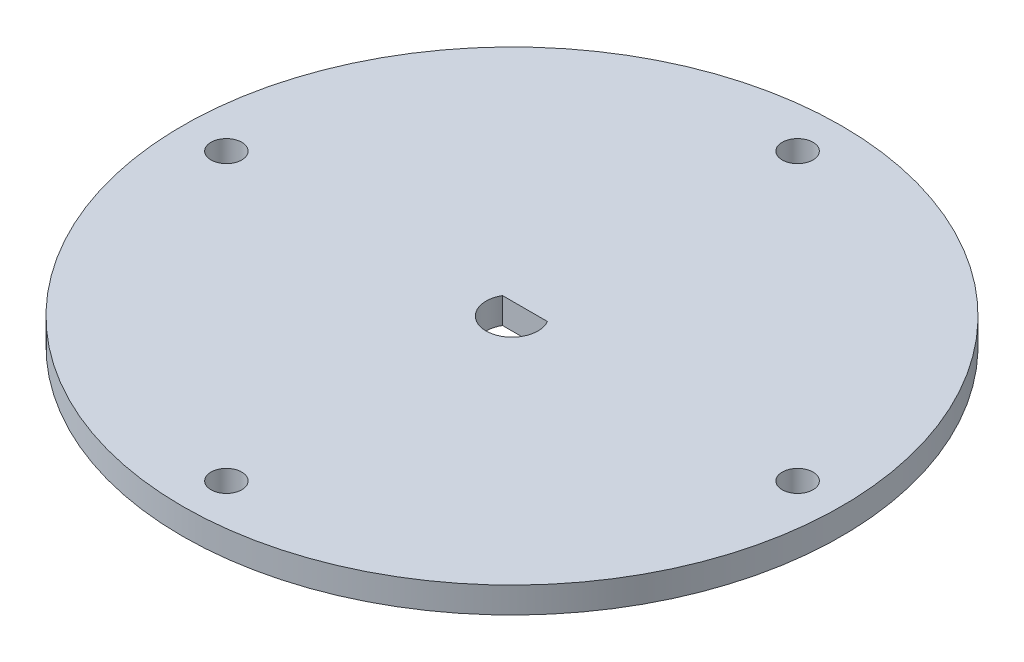
ISO-10303-21;
HEADER;
FILE_DESCRIPTION(('STEP AP214'),'2;1');
FILE_NAME('part.step','',(''),(''),'','','');
FILE_SCHEMA(('AUTOMOTIVE_DESIGN { 1 0 10303 214 1 1 1 1 }'));
ENDSEC;
DATA;
#1=APPLICATION_CONTEXT('core data for automotive mechanical design processes');
#2=APPLICATION_PROTOCOL_DEFINITION('international standard','automotive_design',2000,#1);
#3=PRODUCT_CONTEXT('',#1,'mechanical');
#4=PRODUCT('Part','Part','',(#3));
#5=PRODUCT_RELATED_PRODUCT_CATEGORY('part','',(#4));
#6=PRODUCT_DEFINITION_FORMATION('','',#4);
#7=PRODUCT_DEFINITION_CONTEXT('part definition',#1,'design');
#8=PRODUCT_DEFINITION('design','',#6,#7);
#9=PRODUCT_DEFINITION_SHAPE('','',#8);
#10=(LENGTH_UNIT() NAMED_UNIT(*) SI_UNIT(.MILLI.,.METRE.));
#11=(NAMED_UNIT(*) PLANE_ANGLE_UNIT() SI_UNIT($,.RADIAN.));
#12=(NAMED_UNIT(*) SI_UNIT($,.STERADIAN.) SOLID_ANGLE_UNIT());
#13=UNCERTAINTY_MEASURE_WITH_UNIT(LENGTH_MEASURE(1.E-05),#10,'distance_accuracy_value','');
#14=(GEOMETRIC_REPRESENTATION_CONTEXT(3) GLOBAL_UNCERTAINTY_ASSIGNED_CONTEXT((#13)) GLOBAL_UNIT_ASSIGNED_CONTEXT((#10,
#11,#12)) REPRESENTATION_CONTEXT('',''));
#15=CARTESIAN_POINT('',(0.,0.,0.));
#16=DIRECTION('',(0.,0.,1.));
#17=DIRECTION('',(1.,0.,0.));
#18=AXIS2_PLACEMENT_3D('',#15,#16,#17);
#19=CARTESIAN_POINT('',(0.,3.,0.));
#20=DIRECTION('',(0.,-1.,0.));
#21=DIRECTION('',(0.,0.,-1.));
#22=AXIS2_PLACEMENT_3D('',#19,#20,#21);
#23=CYLINDRICAL_SURFACE('',#22,38.1);
#24=CARTESIAN_POINT('',(0.,3.,0.));
#25=DIRECTION('',(0.,1.,0.));
#26=DIRECTION('',(0.,0.,1.));
#27=AXIS2_PLACEMENT_3D('',#24,#25,#26);
#28=CIRCLE('',#27,38.1);
#29=CARTESIAN_POINT('',(0.,3.,38.1));
#30=VERTEX_POINT('',#29);
#31=EDGE_CURVE('E11',#30,#30,#28,.T.);
#32=ORIENTED_EDGE('',*,*,#31,.F.);
#33=EDGE_LOOP('',(#32));
#34=FACE_BOUND('',#33,.T.);
#35=CARTESIAN_POINT('',(0.,0.,0.));
#36=DIRECTION('',(0.,1.,0.));
#37=DIRECTION('',(0.,0.,1.));
#38=AXIS2_PLACEMENT_3D('',#35,#36,#37);
#39=CIRCLE('',#38,38.1);
#40=CARTESIAN_POINT('',(0.,0.,38.1));
#41=VERTEX_POINT('',#40);
#42=EDGE_CURVE('E40',#41,#41,#39,.T.);
#43=ORIENTED_EDGE('',*,*,#42,.T.);
#44=EDGE_LOOP('',(#43));
#45=FACE_BOUND('',#44,.T.);
#46=ADVANCED_FACE('F37',(#34,#45),#23,.T.);
#47=CARTESIAN_POINT('',(0.,3.,0.));
#48=DIRECTION('',(0.,1.,0.));
#49=DIRECTION('',(0.,0.,1.));
#50=AXIS2_PLACEMENT_3D('',#47,#48,#49);
#51=PLANE('',#50);
#52=CARTESIAN_POINT('',(0.,3.,0.));
#53=DIRECTION('',(0.,1.,0.));
#54=DIRECTION('',(0.,0.,1.));
#55=AXIS2_PLACEMENT_3D('',#52,#53,#54);
#56=CIRCLE('',#55,3.);
#57=CARTESIAN_POINT('',(-2.59807621135332,3.,-1.5));
#58=VERTEX_POINT('',#57);
#59=CARTESIAN_POINT('',(2.59807621135332,3.,-1.5));
#60=VERTEX_POINT('',#59);
#61=EDGE_CURVE('E51',#58,#60,#56,.T.);
#62=ORIENTED_EDGE('',*,*,#61,.F.);
#63=DIRECTION('',(-1.,0.,0.));
#64=VECTOR('',#63,1.);
#65=CARTESIAN_POINT('',(-2.59807621135332,3.,-1.5));
#66=LINE('',#65,#64);
#67=EDGE_CURVE('E71',#60,#58,#66,.T.);
#68=ORIENTED_EDGE('',*,*,#67,.F.);
#69=EDGE_LOOP('',(#62,#68));
#70=FACE_BOUND('',#69,.T.);
#71=CARTESIAN_POINT('',(3.45866141425801E-13,3.,-33.02));
#72=DIRECTION('',(0.,1.,0.));
#73=DIRECTION('',(1.,0.,0.));
#74=AXIS2_PLACEMENT_3D('',#71,#72,#73);
#75=CIRCLE('',#74,1.778);
#76=CARTESIAN_POINT('',(1.77800000000035,3.,-33.02));
#77=VERTEX_POINT('',#76);
#78=EDGE_CURVE('E67',#77,#77,#75,.T.);
#79=ORIENTED_EDGE('',*,*,#78,.F.);
#80=EDGE_LOOP('',(#79));
#81=FACE_BOUND('',#80,.T.);
#82=CARTESIAN_POINT('',(-33.02,3.,0.));
#83=DIRECTION('',(0.,1.,0.));
#84=DIRECTION('',(0.,0.,-1.));
#85=AXIS2_PLACEMENT_3D('',#82,#83,#84);
#86=CIRCLE('',#85,1.778);
#87=CARTESIAN_POINT('',(-33.02,3.,-1.778));
#88=VERTEX_POINT('',#87);
#89=EDGE_CURVE('E86',#88,#88,#86,.T.);
#90=ORIENTED_EDGE('',*,*,#89,.F.);
#91=EDGE_LOOP('',(#90));
#92=FACE_BOUND('',#91,.T.);
#93=CARTESIAN_POINT('',(-1.152887138086E-13,3.,33.02));
#94=DIRECTION('',(0.,1.,0.));
#95=DIRECTION('',(-1.,0.,0.));
#96=AXIS2_PLACEMENT_3D('',#93,#94,#95);
#97=CIRCLE('',#96,1.778);
#98=CARTESIAN_POINT('',(-1.77800000000012,3.,33.02));
#99=VERTEX_POINT('',#98);
#100=EDGE_CURVE('E92',#99,#99,#97,.T.);
#101=ORIENTED_EDGE('',*,*,#100,.F.);
#102=EDGE_LOOP('',(#101));
#103=FACE_BOUND('',#102,.T.);
#104=CARTESIAN_POINT('',(33.02,3.,0.));
#105=DIRECTION('',(0.,1.,0.));
#106=DIRECTION('',(0.,0.,1.));
#107=AXIS2_PLACEMENT_3D('',#104,#105,#106);
#108=CIRCLE('',#107,1.778);
#109=CARTESIAN_POINT('',(33.02,3.,1.778));
#110=VERTEX_POINT('',#109);
#111=EDGE_CURVE('E98',#110,#110,#108,.T.);
#112=ORIENTED_EDGE('',*,*,#111,.F.);
#113=EDGE_LOOP('',(#112));
#114=FACE_BOUND('',#113,.T.);
#115=ORIENTED_EDGE('',*,*,#31,.T.);
#116=EDGE_LOOP('',(#115));
#117=FACE_BOUND('',#116,.T.);
#118=ADVANCED_FACE('F75',(#70,#81,#92,#103,#114,#117),#51,.T.);
#119=CARTESIAN_POINT('',(0.,0.,0.));
#120=DIRECTION('',(0.,1.,0.));
#121=DIRECTION('',(0.,0.,1.));
#122=AXIS2_PLACEMENT_3D('',#119,#120,#121);
#123=PLANE('',#122);
#124=DIRECTION('',(-1.,0.,0.));
#125=VECTOR('',#124,1.);
#126=CARTESIAN_POINT('',(-2.59807621135332,0.,-1.5));
#127=LINE('',#126,#125);
#128=CARTESIAN_POINT('',(2.59807621135332,0.,-1.5));
#129=VERTEX_POINT('',#128);
#130=CARTESIAN_POINT('',(-2.59807621135332,0.,-1.5));
#131=VERTEX_POINT('',#130);
#132=EDGE_CURVE('E79',#129,#131,#127,.T.);
#133=ORIENTED_EDGE('',*,*,#132,.T.);
#134=CARTESIAN_POINT('',(0.,0.,0.));
#135=DIRECTION('',(0.,1.,0.));
#136=DIRECTION('',(0.,0.,1.));
#137=AXIS2_PLACEMENT_3D('',#134,#135,#136);
#138=CIRCLE('',#137,3.);
#139=EDGE_CURVE('E56',#131,#129,#138,.T.);
#140=ORIENTED_EDGE('',*,*,#139,.T.);
#141=EDGE_LOOP('',(#133,#140));
#142=FACE_BOUND('',#141,.T.);
#143=CARTESIAN_POINT('',(3.45866141425801E-13,0.,-33.02));
#144=DIRECTION('',(0.,1.,0.));
#145=DIRECTION('',(1.,0.,0.));
#146=AXIS2_PLACEMENT_3D('',#143,#144,#145);
#147=CIRCLE('',#146,1.778);
#148=CARTESIAN_POINT('',(1.77800000000035,0.,-33.02));
#149=VERTEX_POINT('',#148);
#150=EDGE_CURVE('E83',#149,#149,#147,.T.);
#151=ORIENTED_EDGE('',*,*,#150,.T.);
#152=EDGE_LOOP('',(#151));
#153=FACE_BOUND('',#152,.T.);
#154=CARTESIAN_POINT('',(-33.02,0.,0.));
#155=DIRECTION('',(0.,1.,0.));
#156=DIRECTION('',(0.,0.,-1.));
#157=AXIS2_PLACEMENT_3D('',#154,#155,#156);
#158=CIRCLE('',#157,1.778);
#159=CARTESIAN_POINT('',(-33.02,0.,-1.778));
#160=VERTEX_POINT('',#159);
#161=EDGE_CURVE('E89',#160,#160,#158,.T.);
#162=ORIENTED_EDGE('',*,*,#161,.T.);
#163=EDGE_LOOP('',(#162));
#164=FACE_BOUND('',#163,.T.);
#165=CARTESIAN_POINT('',(-1.152887138086E-13,0.,33.02));
#166=DIRECTION('',(0.,1.,0.));
#167=DIRECTION('',(-1.,0.,0.));
#168=AXIS2_PLACEMENT_3D('',#165,#166,#167);
#169=CIRCLE('',#168,1.778);
#170=CARTESIAN_POINT('',(-1.77800000000012,0.,33.02));
#171=VERTEX_POINT('',#170);
#172=EDGE_CURVE('E95',#171,#171,#169,.T.);
#173=ORIENTED_EDGE('',*,*,#172,.T.);
#174=EDGE_LOOP('',(#173));
#175=FACE_BOUND('',#174,.T.);
#176=CARTESIAN_POINT('',(33.02,0.,0.));
#177=DIRECTION('',(0.,1.,0.));
#178=DIRECTION('',(0.,0.,1.));
#179=AXIS2_PLACEMENT_3D('',#176,#177,#178);
#180=CIRCLE('',#179,1.778);
#181=CARTESIAN_POINT('',(33.02,0.,1.778));
#182=VERTEX_POINT('',#181);
#183=EDGE_CURVE('E101',#182,#182,#180,.T.);
#184=ORIENTED_EDGE('',*,*,#183,.T.);
#185=EDGE_LOOP('',(#184));
#186=FACE_BOUND('',#185,.T.);
#187=ORIENTED_EDGE('',*,*,#42,.F.);
#188=EDGE_LOOP('',(#187));
#189=FACE_BOUND('',#188,.T.);
#190=ADVANCED_FACE('F111',(#142,#153,#164,#175,#186,#189),#123,.F.);
#191=CARTESIAN_POINT('',(33.02,0.,0.));
#192=DIRECTION('',(0.,1.,0.));
#193=DIRECTION('',(0.,0.,1.));
#194=AXIS2_PLACEMENT_3D('',#191,#192,#193);
#195=CYLINDRICAL_SURFACE('',#194,1.778);
#196=ORIENTED_EDGE('',*,*,#183,.F.);
#197=EDGE_LOOP('',(#196));
#198=FACE_BOUND('',#197,.T.);
#199=ORIENTED_EDGE('',*,*,#111,.T.);
#200=EDGE_LOOP('',(#199));
#201=FACE_BOUND('',#200,.T.);
#202=ADVANCED_FACE('F107',(#198,#201),#195,.F.);
#203=CARTESIAN_POINT('',(-1.152887138086E-13,0.,33.02));
#204=DIRECTION('',(0.,1.,0.));
#205=DIRECTION('',(0.,0.,1.));
#206=AXIS2_PLACEMENT_3D('',#203,#204,#205);
#207=CYLINDRICAL_SURFACE('',#206,1.778);
#208=ORIENTED_EDGE('',*,*,#172,.F.);
#209=EDGE_LOOP('',(#208));
#210=FACE_BOUND('',#209,.T.);
#211=ORIENTED_EDGE('',*,*,#100,.T.);
#212=EDGE_LOOP('',(#211));
#213=FACE_BOUND('',#212,.T.);
#214=ADVANCED_FACE('F125',(#210,#213),#207,.F.);
#215=CARTESIAN_POINT('',(-33.02,0.,0.));
#216=DIRECTION('',(0.,1.,0.));
#217=DIRECTION('',(0.,0.,1.));
#218=AXIS2_PLACEMENT_3D('',#215,#216,#217);
#219=CYLINDRICAL_SURFACE('',#218,1.778);
#220=ORIENTED_EDGE('',*,*,#161,.F.);
#221=EDGE_LOOP('',(#220));
#222=FACE_BOUND('',#221,.T.);
#223=ORIENTED_EDGE('',*,*,#89,.T.);
#224=EDGE_LOOP('',(#223));
#225=FACE_BOUND('',#224,.T.);
#226=ADVANCED_FACE('F132',(#222,#225),#219,.F.);
#227=CARTESIAN_POINT('',(3.45866141425801E-13,0.,-33.02));
#228=DIRECTION('',(0.,1.,0.));
#229=DIRECTION('',(0.,0.,1.));
#230=AXIS2_PLACEMENT_3D('',#227,#228,#229);
#231=CYLINDRICAL_SURFACE('',#230,1.778);
#232=ORIENTED_EDGE('',*,*,#150,.F.);
#233=EDGE_LOOP('',(#232));
#234=FACE_BOUND('',#233,.T.);
#235=ORIENTED_EDGE('',*,*,#78,.T.);
#236=EDGE_LOOP('',(#235));
#237=FACE_BOUND('',#236,.T.);
#238=ADVANCED_FACE('F136',(#234,#237),#231,.F.);
#239=CARTESIAN_POINT('',(0.,0.,0.));
#240=DIRECTION('',(0.,1.,0.));
#241=DIRECTION('',(0.,0.,1.));
#242=AXIS2_PLACEMENT_3D('',#239,#240,#241);
#243=CYLINDRICAL_SURFACE('',#242,3.);
#244=ORIENTED_EDGE('',*,*,#61,.T.);
#245=DIRECTION('',(0.,1.,0.));
#246=VECTOR('',#245,1.);
#247=CARTESIAN_POINT('',(2.59807621135332,0.,-1.5));
#248=LINE('',#247,#246);
#249=EDGE_CURVE('E68',#129,#60,#248,.T.);
#250=ORIENTED_EDGE('',*,*,#249,.F.);
#251=ORIENTED_EDGE('',*,*,#139,.F.);
#252=DIRECTION('',(0.,1.,0.));
#253=VECTOR('',#252,1.);
#254=CARTESIAN_POINT('',(-2.59807621135332,0.,-1.5));
#255=LINE('',#254,#253);
#256=EDGE_CURVE('E61',#131,#58,#255,.T.);
#257=ORIENTED_EDGE('',*,*,#256,.T.);
#258=EDGE_LOOP('',(#244,#250,#251,#257));
#259=FACE_BOUND('',#258,.T.);
#260=ADVANCED_FACE('F63',(#259),#243,.F.);
#261=CARTESIAN_POINT('',(-2.59807621135332,0.,-1.5));
#262=DIRECTION('',(0.,0.,-1.));
#263=DIRECTION('',(-1.,0.,0.));
#264=AXIS2_PLACEMENT_3D('',#261,#262,#263);
#265=PLANE('',#264);
#266=ORIENTED_EDGE('',*,*,#67,.T.);
#267=ORIENTED_EDGE('',*,*,#256,.F.);
#268=ORIENTED_EDGE('',*,*,#132,.F.);
#269=ORIENTED_EDGE('',*,*,#249,.T.);
#270=EDGE_LOOP('',(#266,#267,#268,#269));
#271=FACE_BOUND('',#270,.T.);
#272=ADVANCED_FACE('F72',(#271),#265,.F.);
#273=CLOSED_SHELL('',(#46,#118,#190,#202,#214,#226,#238,#260,#272));
#274=MANIFOLD_SOLID_BREP('B2',#273);
#275=ADVANCED_BREP_SHAPE_REPRESENTATION('',(#18,#274),#14);
#276=SHAPE_DEFINITION_REPRESENTATION(#9,#275);
ENDSEC;
END-ISO-10303-21;
